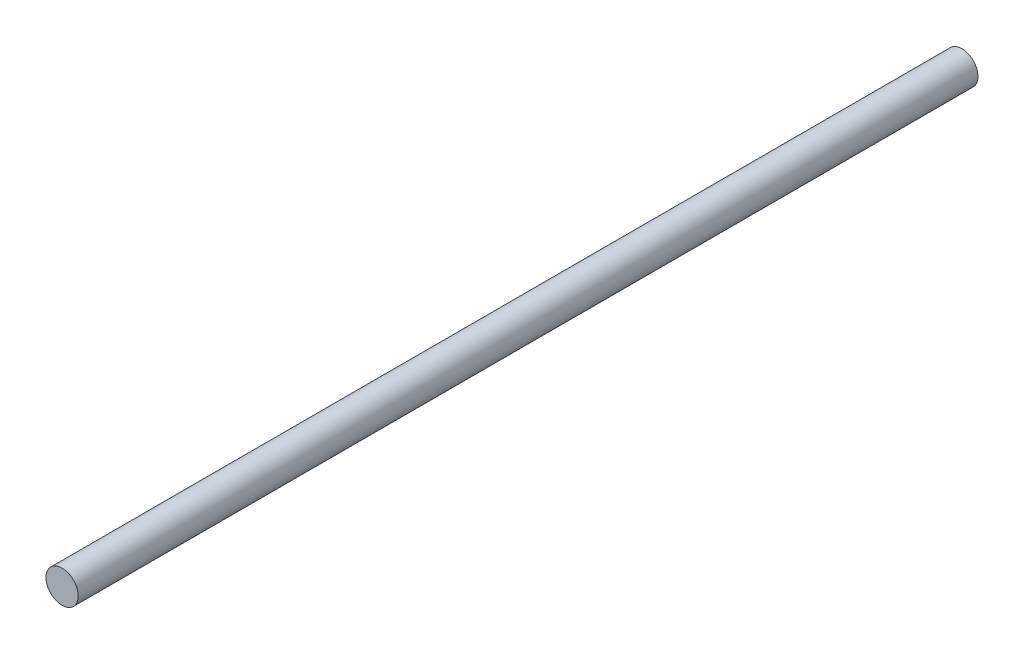
ISO-10303-21;
HEADER;
FILE_DESCRIPTION(('STEP AP214'),'2;1');
FILE_NAME('part.step','',(''),(''),'','','');
FILE_SCHEMA(('AUTOMOTIVE_DESIGN { 1 0 10303 214 1 1 1 1 }'));
ENDSEC;
DATA;
#1=APPLICATION_CONTEXT('core data for automotive mechanical design processes');
#2=APPLICATION_PROTOCOL_DEFINITION('international standard','automotive_design',2000,#1);
#3=PRODUCT_CONTEXT('',#1,'mechanical');
#4=PRODUCT('Part','Part','',(#3));
#5=PRODUCT_RELATED_PRODUCT_CATEGORY('part','',(#4));
#6=PRODUCT_DEFINITION_FORMATION('','',#4);
#7=PRODUCT_DEFINITION_CONTEXT('part definition',#1,'design');
#8=PRODUCT_DEFINITION('design','',#6,#7);
#9=PRODUCT_DEFINITION_SHAPE('','',#8);
#10=(LENGTH_UNIT() NAMED_UNIT(*) SI_UNIT(.MILLI.,.METRE.));
#11=(NAMED_UNIT(*) PLANE_ANGLE_UNIT() SI_UNIT($,.RADIAN.));
#12=(NAMED_UNIT(*) SI_UNIT($,.STERADIAN.) SOLID_ANGLE_UNIT());
#13=UNCERTAINTY_MEASURE_WITH_UNIT(LENGTH_MEASURE(1.E-05),#10,'distance_accuracy_value','');
#14=(GEOMETRIC_REPRESENTATION_CONTEXT(3) GLOBAL_UNCERTAINTY_ASSIGNED_CONTEXT((#13)) GLOBAL_UNIT_ASSIGNED_CONTEXT((#10,
#11,#12)) REPRESENTATION_CONTEXT('',''));
#15=CARTESIAN_POINT('',(0.,0.,0.));
#16=DIRECTION('',(0.,0.,1.));
#17=DIRECTION('',(1.,0.,0.));
#18=AXIS2_PLACEMENT_3D('',#15,#16,#17);
#19=CARTESIAN_POINT('',(0.,0.,223.5));
#20=DIRECTION('',(0.,0.,-1.));
#21=DIRECTION('',(-1.,0.,0.));
#22=AXIS2_PLACEMENT_3D('',#19,#20,#21);
#23=CYLINDRICAL_SURFACE('',#22,4.);
#24=CARTESIAN_POINT('',(0.,0.,223.5));
#25=DIRECTION('',(0.,0.,1.));
#26=DIRECTION('',(1.,0.,0.));
#27=AXIS2_PLACEMENT_3D('',#24,#25,#26);
#28=CIRCLE('',#27,4.);
#29=CARTESIAN_POINT('',(4.,0.,223.5));
#30=VERTEX_POINT('',#29);
#31=EDGE_CURVE('E10',#30,#30,#28,.T.);
#32=ORIENTED_EDGE('',*,*,#31,.F.);
#33=EDGE_LOOP('',(#32));
#34=FACE_BOUND('',#33,.T.);
#35=CARTESIAN_POINT('',(0.,0.,0.));
#36=DIRECTION('',(0.,0.,1.));
#37=DIRECTION('',(1.,0.,0.));
#38=AXIS2_PLACEMENT_3D('',#35,#36,#37);
#39=CIRCLE('',#38,4.);
#40=CARTESIAN_POINT('',(4.,0.,0.));
#41=VERTEX_POINT('',#40);
#42=EDGE_CURVE('E33',#41,#41,#39,.T.);
#43=ORIENTED_EDGE('',*,*,#42,.T.);
#44=EDGE_LOOP('',(#43));
#45=FACE_BOUND('',#44,.T.);
#46=ADVANCED_FACE('F30',(#34,#45),#23,.T.);
#47=CARTESIAN_POINT('',(0.,0.,223.5));
#48=DIRECTION('',(0.,0.,1.));
#49=DIRECTION('',(1.,0.,0.));
#50=AXIS2_PLACEMENT_3D('',#47,#48,#49);
#51=PLANE('',#50);
#52=ORIENTED_EDGE('',*,*,#31,.T.);
#53=EDGE_LOOP('',(#52));
#54=FACE_BOUND('',#53,.T.);
#55=ADVANCED_FACE('F45',(#54),#51,.T.);
#56=CARTESIAN_POINT('',(0.,0.,0.));
#57=DIRECTION('',(0.,0.,1.));
#58=DIRECTION('',(1.,0.,0.));
#59=AXIS2_PLACEMENT_3D('',#56,#57,#58);
#60=PLANE('',#59);
#61=ORIENTED_EDGE('',*,*,#42,.F.);
#62=EDGE_LOOP('',(#61));
#63=FACE_BOUND('',#62,.T.);
#64=ADVANCED_FACE('F43',(#63),#60,.F.);
#65=CLOSED_SHELL('',(#46,#55,#64));
#66=MANIFOLD_SOLID_BREP('B2',#65);
#67=ADVANCED_BREP_SHAPE_REPRESENTATION('',(#18,#66),#14);
#68=SHAPE_DEFINITION_REPRESENTATION(#9,#67);
ENDSEC;
END-ISO-10303-21;
